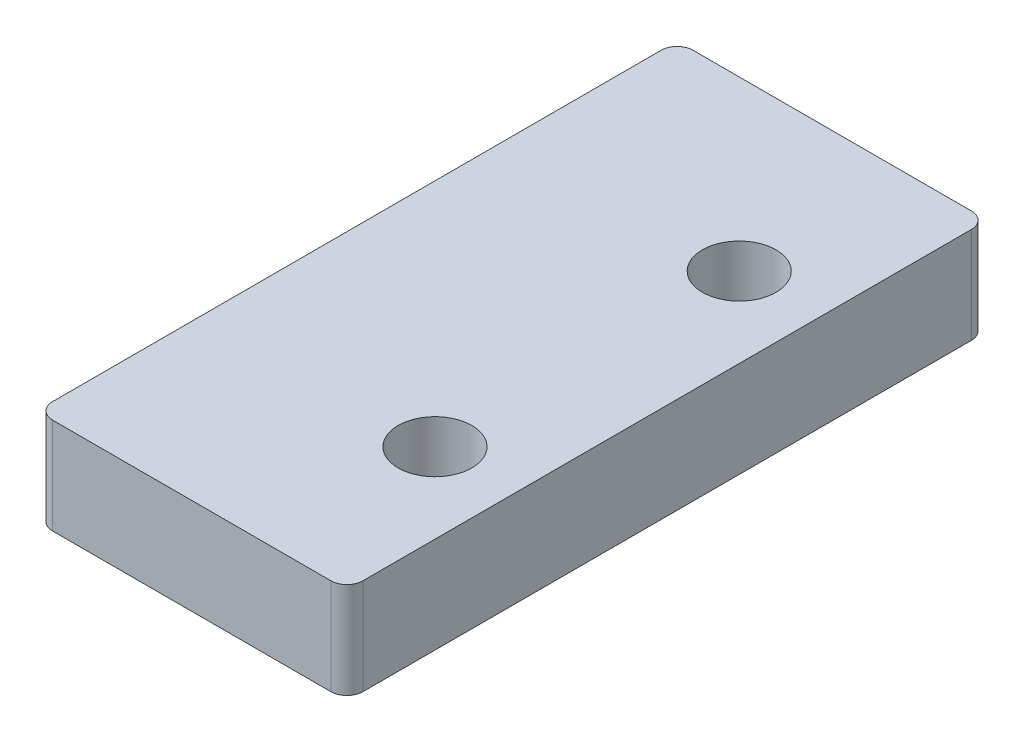
ISO-10303-21;
HEADER;
FILE_DESCRIPTION(('STEP AP214'),'2;1');
FILE_NAME('part.step','',(''),(''),'','','');
FILE_SCHEMA(('AUTOMOTIVE_DESIGN { 1 0 10303 214 1 1 1 1 }'));
ENDSEC;
DATA;
#1=APPLICATION_CONTEXT('core data for automotive mechanical design processes');
#2=APPLICATION_PROTOCOL_DEFINITION('international standard','automotive_design',2000,#1);
#3=PRODUCT_CONTEXT('',#1,'mechanical');
#4=PRODUCT('Part','Part','',(#3));
#5=PRODUCT_RELATED_PRODUCT_CATEGORY('part','',(#4));
#6=PRODUCT_DEFINITION_FORMATION('','',#4);
#7=PRODUCT_DEFINITION_CONTEXT('part definition',#1,'design');
#8=PRODUCT_DEFINITION('design','',#6,#7);
#9=PRODUCT_DEFINITION_SHAPE('','',#8);
#10=(LENGTH_UNIT() NAMED_UNIT(*) SI_UNIT(.MILLI.,.METRE.));
#11=(NAMED_UNIT(*) PLANE_ANGLE_UNIT() SI_UNIT($,.RADIAN.));
#12=(NAMED_UNIT(*) SI_UNIT($,.STERADIAN.) SOLID_ANGLE_UNIT());
#13=UNCERTAINTY_MEASURE_WITH_UNIT(LENGTH_MEASURE(1.E-05),#10,'distance_accuracy_value','');
#14=(GEOMETRIC_REPRESENTATION_CONTEXT(3) GLOBAL_UNCERTAINTY_ASSIGNED_CONTEXT((#13)) GLOBAL_UNIT_ASSIGNED_CONTEXT((#10,
#11,#12)) REPRESENTATION_CONTEXT('',''));
#15=CARTESIAN_POINT('',(0.,0.,0.));
#16=DIRECTION('',(0.,0.,1.));
#17=DIRECTION('',(1.,0.,0.));
#18=AXIS2_PLACEMENT_3D('',#15,#16,#17);
#19=CARTESIAN_POINT('',(0.,0.,0.));
#20=DIRECTION('',(0.,1.,0.));
#21=DIRECTION('',(1.,0.,0.));
#22=AXIS2_PLACEMENT_3D('',#19,#20,#21);
#23=PLANE('',#22);
#24=CARTESIAN_POINT('',(0.,0.,4.75));
#25=DIRECTION('',(0.,-1.,0.));
#26=DIRECTION('',(1.,0.,0.));
#27=AXIS2_PLACEMENT_3D('',#24,#25,#26);
#28=CIRCLE('',#27,1.15);
#29=CARTESIAN_POINT('',(-1.15,0.,4.75));
#30=VERTEX_POINT('',#29);
#31=EDGE_CURVE('E209',#30,#30,#28,.T.);
#32=ORIENTED_EDGE('',*,*,#31,.F.);
#33=EDGE_LOOP('',(#32));
#34=FACE_BOUND('',#33,.T.);
#35=CARTESIAN_POINT('',(0.,0.,-4.75));
#36=DIRECTION('',(0.,-1.,0.));
#37=DIRECTION('',(1.,0.,0.));
#38=AXIS2_PLACEMENT_3D('',#35,#36,#37);
#39=CIRCLE('',#38,1.15);
#40=CARTESIAN_POINT('',(-1.15,0.,-4.75));
#41=VERTEX_POINT('',#40);
#42=EDGE_CURVE('E220',#41,#41,#39,.T.);
#43=ORIENTED_EDGE('',*,*,#42,.F.);
#44=EDGE_LOOP('',(#43));
#45=FACE_BOUND('',#44,.T.);
#46=CARTESIAN_POINT('',(-6.69,0.,-9.5));
#47=DIRECTION('',(0.,1.,0.));
#48=DIRECTION('',(-0.707106781186548,0.,-0.707106781186548));
#49=AXIS2_PLACEMENT_3D('',#46,#47,#48);
#50=CIRCLE('',#49,0.5);
#51=CARTESIAN_POINT('',(-6.69,0.,-10.));
#52=VERTEX_POINT('',#51);
#53=CARTESIAN_POINT('',(-7.19,0.,-9.5));
#54=VERTEX_POINT('',#53);
#55=EDGE_CURVE('E136',#52,#54,#50,.T.);
#56=ORIENTED_EDGE('',*,*,#55,.F.);
#57=DIRECTION('',(-1.,0.,0.));
#58=VECTOR('',#57,1.);
#59=CARTESIAN_POINT('',(2.,0.,-10.));
#60=LINE('',#59,#58);
#61=CARTESIAN_POINT('',(2.,0.,-10.));
#62=VERTEX_POINT('',#61);
#63=EDGE_CURVE('E131',#62,#52,#60,.T.);
#64=ORIENTED_EDGE('',*,*,#63,.F.);
#65=CARTESIAN_POINT('',(2.,0.,-9.5));
#66=DIRECTION('',(0.,1.,0.));
#67=DIRECTION('',(1.,0.,0.));
#68=AXIS2_PLACEMENT_3D('',#65,#66,#67);
#69=CIRCLE('',#68,0.5);
#70=CARTESIAN_POINT('',(2.5,0.,-9.5));
#71=VERTEX_POINT('',#70);
#72=EDGE_CURVE('E219',#71,#62,#69,.T.);
#73=ORIENTED_EDGE('',*,*,#72,.F.);
#74=DIRECTION('',(0.,0.,-1.));
#75=VECTOR('',#74,1.);
#76=CARTESIAN_POINT('',(2.5,0.,9.5));
#77=LINE('',#76,#75);
#78=CARTESIAN_POINT('',(2.5,0.,9.5));
#79=VERTEX_POINT('',#78);
#80=EDGE_CURVE('E42',#79,#71,#77,.T.);
#81=ORIENTED_EDGE('',*,*,#80,.F.);
#82=CARTESIAN_POINT('',(2.,0.,9.5));
#83=DIRECTION('',(0.,1.,0.));
#84=DIRECTION('',(0.,0.,1.));
#85=AXIS2_PLACEMENT_3D('',#82,#83,#84);
#86=CIRCLE('',#85,0.5);
#87=CARTESIAN_POINT('',(2.,0.,10.));
#88=VERTEX_POINT('',#87);
#89=EDGE_CURVE('E11',#88,#79,#86,.T.);
#90=ORIENTED_EDGE('',*,*,#89,.F.);
#91=DIRECTION('',(-1.,0.,0.));
#92=VECTOR('',#91,1.);
#93=CARTESIAN_POINT('',(-2.49999999999997,0.,10.));
#94=LINE('',#93,#92);
#95=CARTESIAN_POINT('',(-6.69,0.,10.));
#96=VERTEX_POINT('',#95);
#97=EDGE_CURVE('E197',#88,#96,#94,.T.);
#98=ORIENTED_EDGE('',*,*,#97,.T.);
#99=CARTESIAN_POINT('',(-6.69,0.,9.5));
#100=DIRECTION('',(0.,1.,0.));
#101=DIRECTION('',(-0.707106781186549,0.,0.707106781186546));
#102=AXIS2_PLACEMENT_3D('',#99,#100,#101);
#103=CIRCLE('',#102,0.5);
#104=CARTESIAN_POINT('',(-7.19,0.,9.5));
#105=VERTEX_POINT('',#104);
#106=EDGE_CURVE('E189',#105,#96,#103,.T.);
#107=ORIENTED_EDGE('',*,*,#106,.F.);
#108=DIRECTION('',(0.,0.,1.));
#109=VECTOR('',#108,1.);
#110=CARTESIAN_POINT('',(-7.19,0.,-10.));
#111=LINE('',#110,#109);
#112=EDGE_CURVE('E201',#54,#105,#111,.T.);
#113=ORIENTED_EDGE('',*,*,#112,.F.);
#114=EDGE_LOOP('',(#56,#64,#73,#81,#90,#98,#107,#113));
#115=FACE_BOUND('',#114,.T.);
#116=ADVANCED_FACE('F17',(#34,#45,#115),#23,.F.);
#117=CARTESIAN_POINT('',(2.,0.,9.5));
#118=DIRECTION('',(0.,1.,0.));
#119=DIRECTION('',(0.,0.,1.));
#120=AXIS2_PLACEMENT_3D('',#117,#118,#119);
#121=CYLINDRICAL_SURFACE('',#120,0.5);
#122=ORIENTED_EDGE('',*,*,#89,.T.);
#123=DIRECTION('',(0.,1.,0.));
#124=VECTOR('',#123,1.);
#125=CARTESIAN_POINT('',(2.5,0.,9.5));
#126=LINE('',#125,#124);
#127=CARTESIAN_POINT('',(2.5,3.,9.5));
#128=VERTEX_POINT('',#127);
#129=EDGE_CURVE('E25',#79,#128,#126,.T.);
#130=ORIENTED_EDGE('',*,*,#129,.T.);
#131=CARTESIAN_POINT('',(2.,3.,9.5));
#132=DIRECTION('',(0.,1.,0.));
#133=DIRECTION('',(0.,0.,1.));
#134=AXIS2_PLACEMENT_3D('',#131,#132,#133);
#135=CIRCLE('',#134,0.5);
#136=CARTESIAN_POINT('',(2.,3.,10.));
#137=VERTEX_POINT('',#136);
#138=EDGE_CURVE('E178',#137,#128,#135,.T.);
#139=ORIENTED_EDGE('',*,*,#138,.F.);
#140=DIRECTION('',(0.,1.,0.));
#141=VECTOR('',#140,1.);
#142=CARTESIAN_POINT('',(2.,0.,10.));
#143=LINE('',#142,#141);
#144=EDGE_CURVE('E199',#88,#137,#143,.T.);
#145=ORIENTED_EDGE('',*,*,#144,.F.);
#146=EDGE_LOOP('',(#122,#130,#139,#145));
#147=FACE_BOUND('',#146,.T.);
#148=ADVANCED_FACE('F235',(#147),#121,.T.);
#149=CARTESIAN_POINT('',(2.5,0.,9.5));
#150=DIRECTION('',(1.,0.,0.));
#151=DIRECTION('',(0.,0.,-1.));
#152=AXIS2_PLACEMENT_3D('',#149,#150,#151);
#153=PLANE('',#152);
#154=ORIENTED_EDGE('',*,*,#80,.T.);
#155=DIRECTION('',(0.,1.,0.));
#156=VECTOR('',#155,1.);
#157=CARTESIAN_POINT('',(2.5,0.,-9.5));
#158=LINE('',#157,#156);
#159=CARTESIAN_POINT('',(2.5,3.,-9.5));
#160=VERTEX_POINT('',#159);
#161=EDGE_CURVE('E224',#71,#160,#158,.T.);
#162=ORIENTED_EDGE('',*,*,#161,.T.);
#163=DIRECTION('',(0.,0.,-1.));
#164=VECTOR('',#163,1.);
#165=CARTESIAN_POINT('',(2.5,3.,9.5));
#166=LINE('',#165,#164);
#167=EDGE_CURVE('E156',#128,#160,#166,.T.);
#168=ORIENTED_EDGE('',*,*,#167,.F.);
#169=ORIENTED_EDGE('',*,*,#129,.F.);
#170=EDGE_LOOP('',(#154,#162,#168,#169));
#171=FACE_BOUND('',#170,.T.);
#172=ADVANCED_FACE('F234',(#171),#153,.T.);
#173=CARTESIAN_POINT('',(2.,0.,-9.5));
#174=DIRECTION('',(0.,1.,0.));
#175=DIRECTION('',(1.,0.,0.));
#176=AXIS2_PLACEMENT_3D('',#173,#174,#175);
#177=CYLINDRICAL_SURFACE('',#176,0.5);
#178=ORIENTED_EDGE('',*,*,#72,.T.);
#179=DIRECTION('',(0.,1.,0.));
#180=VECTOR('',#179,1.);
#181=CARTESIAN_POINT('',(2.,0.,-10.));
#182=LINE('',#181,#180);
#183=CARTESIAN_POINT('',(2.,3.,-10.));
#184=VERTEX_POINT('',#183);
#185=EDGE_CURVE('E163',#62,#184,#182,.T.);
#186=ORIENTED_EDGE('',*,*,#185,.T.);
#187=CARTESIAN_POINT('',(2.,3.,-9.5));
#188=DIRECTION('',(0.,1.,0.));
#189=DIRECTION('',(1.,0.,0.));
#190=AXIS2_PLACEMENT_3D('',#187,#188,#189);
#191=CIRCLE('',#190,0.5);
#192=EDGE_CURVE('E181',#160,#184,#191,.T.);
#193=ORIENTED_EDGE('',*,*,#192,.F.);
#194=ORIENTED_EDGE('',*,*,#161,.F.);
#195=EDGE_LOOP('',(#178,#186,#193,#194));
#196=FACE_BOUND('',#195,.T.);
#197=ADVANCED_FACE('F249',(#196),#177,.T.);
#198=CARTESIAN_POINT('',(0.,0.,-4.75));
#199=DIRECTION('',(0.,1.,0.));
#200=DIRECTION('',(1.,0.,0.));
#201=AXIS2_PLACEMENT_3D('',#198,#199,#200);
#202=CYLINDRICAL_SURFACE('',#201,1.15);
#203=CARTESIAN_POINT('',(0.,3.,-4.75));
#204=DIRECTION('',(0.,-1.,0.));
#205=DIRECTION('',(1.,0.,0.));
#206=AXIS2_PLACEMENT_3D('',#203,#204,#205);
#207=CIRCLE('',#206,1.15);
#208=CARTESIAN_POINT('',(-1.15,3.,-4.75));
#209=VERTEX_POINT('',#208);
#210=EDGE_CURVE('E159',#209,#209,#207,.T.);
#211=ORIENTED_EDGE('',*,*,#210,.F.);
#212=DIRECTION('',(0.,-1.,0.));
#213=VECTOR('',#212,1.);
#214=CARTESIAN_POINT('',(-1.15,0.,-4.75));
#215=LINE('',#214,#213);
#216=EDGE_CURVE('E213',#209,#41,#215,.T.);
#217=ORIENTED_EDGE('',*,*,#216,.T.);
#218=ORIENTED_EDGE('',*,*,#42,.T.);
#219=ORIENTED_EDGE('',*,*,#216,.F.);
#220=EDGE_LOOP('',(#211,#217,#218,#219));
#221=FACE_BOUND('',#220,.T.);
#222=ADVANCED_FACE('F272',(#221),#202,.F.);
#223=CARTESIAN_POINT('',(0.,0.,4.75));
#224=DIRECTION('',(0.,1.,0.));
#225=DIRECTION('',(1.,0.,0.));
#226=AXIS2_PLACEMENT_3D('',#223,#224,#225);
#227=CYLINDRICAL_SURFACE('',#226,1.15);
#228=CARTESIAN_POINT('',(0.,3.,4.75));
#229=DIRECTION('',(0.,-1.,0.));
#230=DIRECTION('',(1.,0.,0.));
#231=AXIS2_PLACEMENT_3D('',#228,#229,#230);
#232=CIRCLE('',#231,1.15);
#233=CARTESIAN_POINT('',(-1.15,3.,4.75));
#234=VERTEX_POINT('',#233);
#235=EDGE_CURVE('E160',#234,#234,#232,.T.);
#236=ORIENTED_EDGE('',*,*,#235,.F.);
#237=DIRECTION('',(0.,-1.,0.));
#238=VECTOR('',#237,1.);
#239=CARTESIAN_POINT('',(-1.15,0.,4.75));
#240=LINE('',#239,#238);
#241=EDGE_CURVE('E206',#234,#30,#240,.T.);
#242=ORIENTED_EDGE('',*,*,#241,.T.);
#243=ORIENTED_EDGE('',*,*,#31,.T.);
#244=ORIENTED_EDGE('',*,*,#241,.F.);
#245=EDGE_LOOP('',(#236,#242,#243,#244));
#246=FACE_BOUND('',#245,.T.);
#247=ADVANCED_FACE('F277',(#246),#227,.F.);
#248=CARTESIAN_POINT('',(-7.19,0.,-10.));
#249=DIRECTION('',(-1.,0.,0.));
#250=DIRECTION('',(0.,1.,0.));
#251=AXIS2_PLACEMENT_3D('',#248,#249,#250);
#252=PLANE('',#251);
#253=DIRECTION('',(0.,1.,0.));
#254=VECTOR('',#253,1.);
#255=CARTESIAN_POINT('',(-7.19,0.,-9.5));
#256=LINE('',#255,#254);
#257=CARTESIAN_POINT('',(-7.19,3.,-9.5));
#258=VERTEX_POINT('',#257);
#259=EDGE_CURVE('E121',#54,#258,#256,.T.);
#260=ORIENTED_EDGE('',*,*,#259,.F.);
#261=ORIENTED_EDGE('',*,*,#112,.T.);
#262=DIRECTION('',(0.,-1.,0.));
#263=VECTOR('',#262,1.);
#264=CARTESIAN_POINT('',(-7.19,0.,9.5));
#265=LINE('',#264,#263);
#266=CARTESIAN_POINT('',(-7.19,3.,9.5));
#267=VERTEX_POINT('',#266);
#268=EDGE_CURVE('E122',#267,#105,#265,.T.);
#269=ORIENTED_EDGE('',*,*,#268,.F.);
#270=DIRECTION('',(0.,0.,1.));
#271=VECTOR('',#270,1.);
#272=CARTESIAN_POINT('',(-7.19,3.,-10.));
#273=LINE('',#272,#271);
#274=EDGE_CURVE('E119',#258,#267,#273,.T.);
#275=ORIENTED_EDGE('',*,*,#274,.F.);
#276=EDGE_LOOP('',(#260,#261,#269,#275));
#277=FACE_BOUND('',#276,.T.);
#278=ADVANCED_FACE('F120',(#277),#252,.T.);
#279=CARTESIAN_POINT('',(-2.49999999999997,0.,10.));
#280=DIRECTION('',(0.,0.,1.));
#281=DIRECTION('',(1.,0.,0.));
#282=AXIS2_PLACEMENT_3D('',#279,#280,#281);
#283=PLANE('',#282);
#284=DIRECTION('',(0.,1.,0.));
#285=VECTOR('',#284,1.);
#286=CARTESIAN_POINT('',(-6.69,0.,10.));
#287=LINE('',#286,#285);
#288=CARTESIAN_POINT('',(-6.69,3.,10.));
#289=VERTEX_POINT('',#288);
#290=EDGE_CURVE('E191',#96,#289,#287,.T.);
#291=ORIENTED_EDGE('',*,*,#290,.F.);
#292=ORIENTED_EDGE('',*,*,#97,.F.);
#293=ORIENTED_EDGE('',*,*,#144,.T.);
#294=DIRECTION('',(-1.,0.,0.));
#295=VECTOR('',#294,1.);
#296=CARTESIAN_POINT('',(-2.49999999999997,3.,10.));
#297=LINE('',#296,#295);
#298=EDGE_CURVE('E173',#137,#289,#297,.T.);
#299=ORIENTED_EDGE('',*,*,#298,.T.);
#300=EDGE_LOOP('',(#291,#292,#293,#299));
#301=FACE_BOUND('',#300,.T.);
#302=ADVANCED_FACE('F239',(#301),#283,.T.);
#303=CARTESIAN_POINT('',(-6.69,0.,9.5));
#304=DIRECTION('',(0.,1.,0.));
#305=DIRECTION('',(-0.707106781186549,0.,0.707106781186546));
#306=AXIS2_PLACEMENT_3D('',#303,#304,#305);
#307=CYLINDRICAL_SURFACE('',#306,0.5);
#308=CARTESIAN_POINT('',(-6.69,3.,9.5));
#309=DIRECTION('',(0.,-1.,0.));
#310=DIRECTION('',(-0.707106781186549,0.,0.707106781186546));
#311=AXIS2_PLACEMENT_3D('',#308,#309,#310);
#312=CIRCLE('',#311,0.5);
#313=EDGE_CURVE('E129',#289,#267,#312,.T.);
#314=ORIENTED_EDGE('',*,*,#313,.T.);
#315=ORIENTED_EDGE('',*,*,#268,.T.);
#316=ORIENTED_EDGE('',*,*,#106,.T.);
#317=ORIENTED_EDGE('',*,*,#290,.T.);
#318=EDGE_LOOP('',(#314,#315,#316,#317));
#319=FACE_BOUND('',#318,.T.);
#320=ADVANCED_FACE('F259',(#319),#307,.T.);
#321=CARTESIAN_POINT('',(0.,3.,0.));
#322=DIRECTION('',(0.,1.,0.));
#323=DIRECTION('',(1.,0.,0.));
#324=AXIS2_PLACEMENT_3D('',#321,#322,#323);
#325=PLANE('',#324);
#326=ORIENTED_EDGE('',*,*,#235,.T.);
#327=EDGE_LOOP('',(#326));
#328=FACE_BOUND('',#327,.T.);
#329=ORIENTED_EDGE('',*,*,#210,.T.);
#330=EDGE_LOOP('',(#329));
#331=FACE_BOUND('',#330,.T.);
#332=CARTESIAN_POINT('',(-6.69,3.,-9.5));
#333=DIRECTION('',(0.,-1.,0.));
#334=DIRECTION('',(-0.707106781186548,0.,-0.707106781186548));
#335=AXIS2_PLACEMENT_3D('',#332,#333,#334);
#336=CIRCLE('',#335,0.5);
#337=CARTESIAN_POINT('',(-6.69,3.,-10.));
#338=VERTEX_POINT('',#337);
#339=EDGE_CURVE('E140',#258,#338,#336,.T.);
#340=ORIENTED_EDGE('',*,*,#339,.F.);
#341=ORIENTED_EDGE('',*,*,#274,.T.);
#342=ORIENTED_EDGE('',*,*,#313,.F.);
#343=ORIENTED_EDGE('',*,*,#298,.F.);
#344=ORIENTED_EDGE('',*,*,#138,.T.);
#345=ORIENTED_EDGE('',*,*,#167,.T.);
#346=ORIENTED_EDGE('',*,*,#192,.T.);
#347=DIRECTION('',(-1.,0.,0.));
#348=VECTOR('',#347,1.);
#349=CARTESIAN_POINT('',(2.,3.,-10.));
#350=LINE('',#349,#348);
#351=EDGE_CURVE('E143',#184,#338,#350,.T.);
#352=ORIENTED_EDGE('',*,*,#351,.T.);
#353=EDGE_LOOP('',(#340,#341,#342,#343,#344,#345,#346,#352));
#354=FACE_BOUND('',#353,.T.);
#355=ADVANCED_FACE('F141',(#328,#331,#354),#325,.T.);
#356=CARTESIAN_POINT('',(2.,0.,-10.));
#357=DIRECTION('',(0.,0.,-1.));
#358=DIRECTION('',(0.,-1.,0.));
#359=AXIS2_PLACEMENT_3D('',#356,#357,#358);
#360=PLANE('',#359);
#361=DIRECTION('',(0.,-1.,0.));
#362=VECTOR('',#361,1.);
#363=CARTESIAN_POINT('',(-6.69,0.,-10.));
#364=LINE('',#363,#362);
#365=EDGE_CURVE('E150',#338,#52,#364,.T.);
#366=ORIENTED_EDGE('',*,*,#365,.F.);
#367=ORIENTED_EDGE('',*,*,#351,.F.);
#368=ORIENTED_EDGE('',*,*,#185,.F.);
#369=ORIENTED_EDGE('',*,*,#63,.T.);
#370=EDGE_LOOP('',(#366,#367,#368,#369));
#371=FACE_BOUND('',#370,.T.);
#372=ADVANCED_FACE('F248',(#371),#360,.T.);
#373=CARTESIAN_POINT('',(-6.69,0.,-9.5));
#374=DIRECTION('',(0.,1.,0.));
#375=DIRECTION('',(-0.707106781186548,0.,-0.707106781186548));
#376=AXIS2_PLACEMENT_3D('',#373,#374,#375);
#377=CYLINDRICAL_SURFACE('',#376,0.5);
#378=ORIENTED_EDGE('',*,*,#339,.T.);
#379=ORIENTED_EDGE('',*,*,#365,.T.);
#380=ORIENTED_EDGE('',*,*,#55,.T.);
#381=ORIENTED_EDGE('',*,*,#259,.T.);
#382=EDGE_LOOP('',(#378,#379,#380,#381));
#383=FACE_BOUND('',#382,.T.);
#384=ADVANCED_FACE('F134',(#383),#377,.T.);
#385=CLOSED_SHELL('',(#116,#148,#172,#197,#222,#247,#278,#302,#320,#355,#372,#384));
#386=MANIFOLD_SOLID_BREP('B1',#385);
#387=ADVANCED_BREP_SHAPE_REPRESENTATION('',(#18,#386),#14);
#388=SHAPE_DEFINITION_REPRESENTATION(#9,#387);
ENDSEC;
END-ISO-10303-21;
